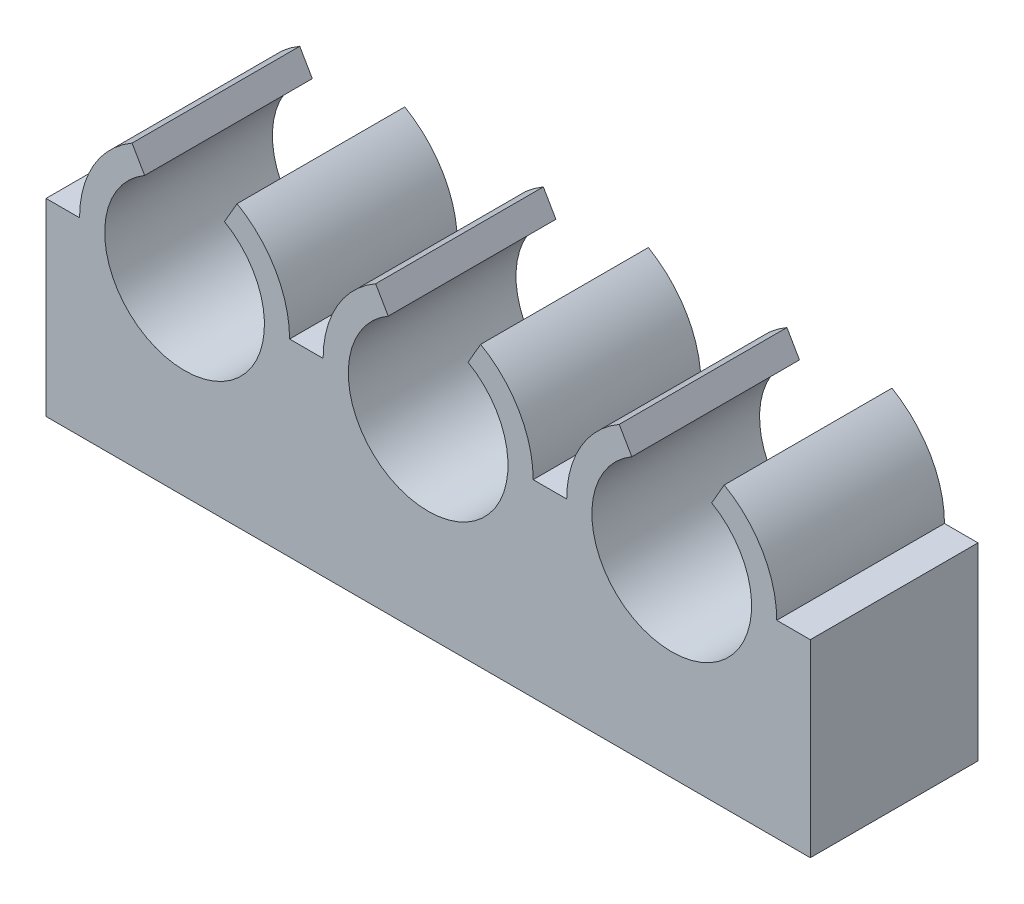
ISO-10303-21;
HEADER;
FILE_DESCRIPTION(('STEP AP214'),'2;1');
FILE_NAME('part.step','',(''),(''),'','','');
FILE_SCHEMA(('AUTOMOTIVE_DESIGN { 1 0 10303 214 1 1 1 1 }'));
ENDSEC;
DATA;
#1=APPLICATION_CONTEXT('core data for automotive mechanical design processes');
#2=APPLICATION_PROTOCOL_DEFINITION('international standard','automotive_design',2000,#1);
#3=PRODUCT_CONTEXT('',#1,'mechanical');
#4=PRODUCT('Part','Part','',(#3));
#5=PRODUCT_RELATED_PRODUCT_CATEGORY('part','',(#4));
#6=PRODUCT_DEFINITION_FORMATION('','',#4);
#7=PRODUCT_DEFINITION_CONTEXT('part definition',#1,'design');
#8=PRODUCT_DEFINITION('design','',#6,#7);
#9=PRODUCT_DEFINITION_SHAPE('','',#8);
#10=(LENGTH_UNIT() NAMED_UNIT(*) SI_UNIT(.MILLI.,.METRE.));
#11=(NAMED_UNIT(*) PLANE_ANGLE_UNIT() SI_UNIT($,.RADIAN.));
#12=(NAMED_UNIT(*) SI_UNIT($,.STERADIAN.) SOLID_ANGLE_UNIT());
#13=UNCERTAINTY_MEASURE_WITH_UNIT(LENGTH_MEASURE(1.E-05),#10,'distance_accuracy_value','');
#14=(GEOMETRIC_REPRESENTATION_CONTEXT(3) GLOBAL_UNCERTAINTY_ASSIGNED_CONTEXT((#13)) GLOBAL_UNIT_ASSIGNED_CONTEXT((#10,
#11,#12)) REPRESENTATION_CONTEXT('',''));
#15=CARTESIAN_POINT('',(0.,0.,0.));
#16=DIRECTION('',(0.,0.,1.));
#17=DIRECTION('',(1.,0.,0.));
#18=AXIS2_PLACEMENT_3D('',#15,#16,#17);
#19=CARTESIAN_POINT('',(0.,0.,10.));
#20=DIRECTION('',(0.,1.,0.));
#21=DIRECTION('',(-1.,0.,0.));
#22=AXIS2_PLACEMENT_3D('',#19,#20,#21);
#23=PLANE('',#22);
#24=DIRECTION('',(1.,0.,0.));
#25=VECTOR('',#24,1.);
#26=CARTESIAN_POINT('',(0.,0.,0.));
#27=LINE('',#26,#25);
#28=CARTESIAN_POINT('',(20.7875,0.,0.));
#29=VERTEX_POINT('',#28);
#30=CARTESIAN_POINT('',(22.7875,0.,0.));
#31=VERTEX_POINT('',#30);
#32=EDGE_CURVE('E213',#29,#31,#27,.T.);
#33=ORIENTED_EDGE('',*,*,#32,.F.);
#34=DIRECTION('',(0.,0.,-1.));
#35=VECTOR('',#34,1.);
#36=CARTESIAN_POINT('',(20.7875,0.,10.));
#37=LINE('',#36,#35);
#38=CARTESIAN_POINT('',(20.7875,0.,10.));
#39=VERTEX_POINT('',#38);
#40=EDGE_CURVE('E11',#39,#29,#37,.T.);
#41=ORIENTED_EDGE('',*,*,#40,.F.);
#42=DIRECTION('',(1.,0.,0.));
#43=VECTOR('',#42,1.);
#44=CARTESIAN_POINT('',(0.,0.,10.));
#45=LINE('',#44,#43);
#46=CARTESIAN_POINT('',(22.7875,0.,10.));
#47=VERTEX_POINT('',#46);
#48=EDGE_CURVE('E268',#39,#47,#45,.T.);
#49=ORIENTED_EDGE('',*,*,#48,.T.);
#50=DIRECTION('',(0.,0.,-1.));
#51=VECTOR('',#50,1.);
#52=CARTESIAN_POINT('',(22.7875,0.,10.));
#53=LINE('',#52,#51);
#54=EDGE_CURVE('E51',#47,#31,#53,.T.);
#55=ORIENTED_EDGE('',*,*,#54,.T.);
#56=EDGE_LOOP('',(#33,#41,#49,#55));
#57=FACE_BOUND('',#56,.T.);
#58=ADVANCED_FACE('F35',(#57),#23,.T.);
#59=CARTESIAN_POINT('',(14.525,0.,10.));
#60=DIRECTION('',(0.,0.,-1.));
#61=DIRECTION('',(-1.,0.,0.));
#62=AXIS2_PLACEMENT_3D('',#59,#60,#61);
#63=CYLINDRICAL_SURFACE('',#62,6.2625);
#64=CARTESIAN_POINT('',(14.525,0.,0.));
#65=DIRECTION('',(0.,0.,1.));
#66=DIRECTION('',(1.,0.,0.));
#67=AXIS2_PLACEMENT_3D('',#64,#65,#66);
#68=CIRCLE('',#67,6.2625);
#69=CARTESIAN_POINT('',(17.65625,5.42348409120007,0.));
#70=VERTEX_POINT('',#69);
#71=EDGE_CURVE('E215',#29,#70,#68,.T.);
#72=ORIENTED_EDGE('',*,*,#71,.T.);
#73=DIRECTION('',(0.,0.,-1.));
#74=VECTOR('',#73,1.);
#75=CARTESIAN_POINT('',(17.65625,5.42348409120007,10.));
#76=LINE('',#75,#74);
#77=CARTESIAN_POINT('',(17.65625,5.42348409120007,10.));
#78=VERTEX_POINT('',#77);
#79=EDGE_CURVE('E43',#78,#70,#76,.T.);
#80=ORIENTED_EDGE('',*,*,#79,.F.);
#81=CARTESIAN_POINT('',(14.525,0.,10.));
#82=DIRECTION('',(0.,0.,1.));
#83=DIRECTION('',(1.,0.,0.));
#84=AXIS2_PLACEMENT_3D('',#81,#82,#83);
#85=CIRCLE('',#84,6.2625);
#86=EDGE_CURVE('E326',#39,#78,#85,.T.);
#87=ORIENTED_EDGE('',*,*,#86,.F.);
#88=ORIENTED_EDGE('',*,*,#40,.T.);
#89=EDGE_LOOP('',(#72,#80,#87,#88));
#90=FACE_BOUND('',#89,.T.);
#91=ADVANCED_FACE('F313',(#90),#63,.T.);
#92=CARTESIAN_POINT('',(10.8937500000001,-6.28950949498444,10.));
#93=DIRECTION('',(-0.866025403784442,0.499999999999994,0.));
#94=DIRECTION('',(-0.499999999999994,-0.866025403784442,0.));
#95=AXIS2_PLACEMENT_3D('',#92,#93,#94);
#96=PLANE('',#95);
#97=DIRECTION('',(0.499999999999994,0.866025403784442,0.));
#98=VECTOR('',#97,1.);
#99=CARTESIAN_POINT('',(10.8937500000001,-6.28950949498444,0.));
#100=LINE('',#99,#98);
#101=CARTESIAN_POINT('',(16.90625,4.1244459855234,0.));
#102=VERTEX_POINT('',#101);
#103=EDGE_CURVE('E218',#102,#70,#100,.T.);
#104=ORIENTED_EDGE('',*,*,#103,.F.);
#105=DIRECTION('',(0.,0.,-1.));
#106=VECTOR('',#105,1.);
#107=CARTESIAN_POINT('',(16.90625,4.1244459855234,10.));
#108=LINE('',#107,#106);
#109=CARTESIAN_POINT('',(16.90625,4.1244459855234,10.));
#110=VERTEX_POINT('',#109);
#111=EDGE_CURVE('E303',#110,#102,#108,.T.);
#112=ORIENTED_EDGE('',*,*,#111,.F.);
#113=DIRECTION('',(0.499999999999994,0.866025403784442,0.));
#114=VECTOR('',#113,1.);
#115=CARTESIAN_POINT('',(10.8937500000001,-6.28950949498444,10.));
#116=LINE('',#115,#114);
#117=EDGE_CURVE('E310',#110,#78,#116,.T.);
#118=ORIENTED_EDGE('',*,*,#117,.T.);
#119=ORIENTED_EDGE('',*,*,#79,.T.);
#120=EDGE_LOOP('',(#104,#112,#118,#119));
#121=FACE_BOUND('',#120,.T.);
#122=ADVANCED_FACE('F308',(#121),#96,.T.);
#123=CARTESIAN_POINT('',(14.525,0.,10.));
#124=DIRECTION('',(0.,0.,-1.));
#125=DIRECTION('',(-1.,0.,0.));
#126=AXIS2_PLACEMENT_3D('',#123,#124,#125);
#127=CYLINDRICAL_SURFACE('',#126,4.7625);
#128=CARTESIAN_POINT('',(14.525,0.,0.));
#129=DIRECTION('',(0.,0.,1.));
#130=DIRECTION('',(1.,0.,0.));
#131=AXIS2_PLACEMENT_3D('',#128,#129,#130);
#132=CIRCLE('',#131,4.7625);
#133=CARTESIAN_POINT('',(12.14375,4.12444598552338,0.));
#134=VERTEX_POINT('',#133);
#135=EDGE_CURVE('E222',#134,#102,#132,.T.);
#136=ORIENTED_EDGE('',*,*,#135,.F.);
#137=DIRECTION('',(0.,0.,-1.));
#138=VECTOR('',#137,1.);
#139=CARTESIAN_POINT('',(12.14375,4.12444598552338,10.));
#140=LINE('',#139,#138);
#141=CARTESIAN_POINT('',(12.14375,4.12444598552338,10.));
#142=VERTEX_POINT('',#141);
#143=EDGE_CURVE('E301',#142,#134,#140,.T.);
#144=ORIENTED_EDGE('',*,*,#143,.F.);
#145=CARTESIAN_POINT('',(14.525,0.,10.));
#146=DIRECTION('',(0.,0.,1.));
#147=DIRECTION('',(1.,0.,0.));
#148=AXIS2_PLACEMENT_3D('',#145,#146,#147);
#149=CIRCLE('',#148,4.7625);
#150=EDGE_CURVE('E323',#142,#110,#149,.T.);
#151=ORIENTED_EDGE('',*,*,#150,.T.);
#152=ORIENTED_EDGE('',*,*,#111,.T.);
#153=EDGE_LOOP('',(#136,#144,#151,#152));
#154=FACE_BOUND('',#153,.T.);
#155=ADVANCED_FACE('F320',(#154),#127,.F.);
#156=CARTESIAN_POINT('',(10.89375,6.2895094949845,10.));
#157=DIRECTION('',(0.866025403784438,0.500000000000001,0.));
#158=DIRECTION('',(-0.500000000000001,0.866025403784438,0.));
#159=AXIS2_PLACEMENT_3D('',#156,#157,#158);
#160=PLANE('',#159);
#161=DIRECTION('',(0.500000000000001,-0.866025403784438,0.));
#162=VECTOR('',#161,1.);
#163=CARTESIAN_POINT('',(10.89375,6.2895094949845,0.));
#164=LINE('',#163,#162);
#165=CARTESIAN_POINT('',(11.39375,5.42348409120004,0.));
#166=VERTEX_POINT('',#165);
#167=EDGE_CURVE('E225',#166,#134,#164,.T.);
#168=ORIENTED_EDGE('',*,*,#167,.F.);
#169=DIRECTION('',(0.,0.,-1.));
#170=VECTOR('',#169,1.);
#171=CARTESIAN_POINT('',(11.39375,5.42348409120004,10.));
#172=LINE('',#171,#170);
#173=CARTESIAN_POINT('',(11.39375,5.42348409120004,10.));
#174=VERTEX_POINT('',#173);
#175=EDGE_CURVE('E299',#174,#166,#172,.T.);
#176=ORIENTED_EDGE('',*,*,#175,.F.);
#177=DIRECTION('',(0.500000000000001,-0.866025403784438,0.));
#178=VECTOR('',#177,1.);
#179=CARTESIAN_POINT('',(10.89375,6.2895094949845,10.));
#180=LINE('',#179,#178);
#181=EDGE_CURVE('E328',#174,#142,#180,.T.);
#182=ORIENTED_EDGE('',*,*,#181,.T.);
#183=ORIENTED_EDGE('',*,*,#143,.T.);
#184=EDGE_LOOP('',(#168,#176,#182,#183));
#185=FACE_BOUND('',#184,.T.);
#186=ADVANCED_FACE('F397',(#185),#160,.T.);
#187=CARTESIAN_POINT('',(8.2625,0.,0.));
#188=VERTEX_POINT('',#187);
#189=EDGE_CURVE('E219',#166,#188,#68,.T.);
#190=ORIENTED_EDGE('',*,*,#189,.T.);
#191=DIRECTION('',(0.,0.,-1.));
#192=VECTOR('',#191,1.);
#193=CARTESIAN_POINT('',(8.2625,0.,10.));
#194=LINE('',#193,#192);
#195=CARTESIAN_POINT('',(8.2625,0.,10.));
#196=VERTEX_POINT('',#195);
#197=EDGE_CURVE('E297',#196,#188,#194,.T.);
#198=ORIENTED_EDGE('',*,*,#197,.F.);
#199=EDGE_CURVE('E331',#174,#196,#85,.T.);
#200=ORIENTED_EDGE('',*,*,#199,.F.);
#201=ORIENTED_EDGE('',*,*,#175,.T.);
#202=EDGE_LOOP('',(#190,#198,#200,#201));
#203=FACE_BOUND('',#202,.T.);
#204=ADVANCED_FACE('F389',(#203),#63,.T.);
#205=CARTESIAN_POINT('',(0.,0.,10.));
#206=DIRECTION('',(0.,1.,0.));
#207=DIRECTION('',(0.,0.,1.));
#208=AXIS2_PLACEMENT_3D('',#205,#206,#207);
#209=PLANE('',#208);
#210=DIRECTION('',(1.,0.,0.));
#211=VECTOR('',#210,1.);
#212=CARTESIAN_POINT('',(0.,0.,0.));
#213=LINE('',#212,#211);
#214=CARTESIAN_POINT('',(6.2625,0.,0.));
#215=VERTEX_POINT('',#214);
#216=EDGE_CURVE('E228',#215,#188,#213,.T.);
#217=ORIENTED_EDGE('',*,*,#216,.F.);
#218=DIRECTION('',(0.,0.,-1.));
#219=VECTOR('',#218,1.);
#220=CARTESIAN_POINT('',(6.2625,0.,10.));
#221=LINE('',#220,#219);
#222=CARTESIAN_POINT('',(6.2625,0.,10.));
#223=VERTEX_POINT('',#222);
#224=EDGE_CURVE('E295',#223,#215,#221,.T.);
#225=ORIENTED_EDGE('',*,*,#224,.F.);
#226=DIRECTION('',(1.,0.,0.));
#227=VECTOR('',#226,1.);
#228=CARTESIAN_POINT('',(0.,0.,10.));
#229=LINE('',#228,#227);
#230=EDGE_CURVE('E335',#223,#196,#229,.T.);
#231=ORIENTED_EDGE('',*,*,#230,.T.);
#232=ORIENTED_EDGE('',*,*,#197,.T.);
#233=EDGE_LOOP('',(#217,#225,#231,#232));
#234=FACE_BOUND('',#233,.T.);
#235=ADVANCED_FACE('F396',(#234),#209,.T.);
#236=CARTESIAN_POINT('',(0.,0.,10.));
#237=DIRECTION('',(0.,0.,-1.));
#238=DIRECTION('',(-1.,0.,0.));
#239=AXIS2_PLACEMENT_3D('',#236,#237,#238);
#240=CYLINDRICAL_SURFACE('',#239,6.2625);
#241=CARTESIAN_POINT('',(0.,0.,0.));
#242=DIRECTION('',(0.,0.,1.));
#243=DIRECTION('',(1.,0.,0.));
#244=AXIS2_PLACEMENT_3D('',#241,#242,#243);
#245=CIRCLE('',#244,6.2625);
#246=CARTESIAN_POINT('',(3.13124999999997,5.42348409120006,0.));
#247=VERTEX_POINT('',#246);
#248=EDGE_CURVE('E231',#215,#247,#245,.T.);
#249=ORIENTED_EDGE('',*,*,#248,.T.);
#250=DIRECTION('',(0.,0.,-1.));
#251=VECTOR('',#250,1.);
#252=CARTESIAN_POINT('',(3.13124999999997,5.42348409120006,10.));
#253=LINE('',#252,#251);
#254=CARTESIAN_POINT('',(3.13124999999997,5.42348409120006,10.));
#255=VERTEX_POINT('',#254);
#256=EDGE_CURVE('E293',#255,#247,#253,.T.);
#257=ORIENTED_EDGE('',*,*,#256,.F.);
#258=CARTESIAN_POINT('',(0.,0.,10.));
#259=DIRECTION('',(0.,0.,1.));
#260=DIRECTION('',(1.,0.,0.));
#261=AXIS2_PLACEMENT_3D('',#258,#259,#260);
#262=CIRCLE('',#261,6.2625);
#263=EDGE_CURVE('E338',#223,#255,#262,.T.);
#264=ORIENTED_EDGE('',*,*,#263,.F.);
#265=ORIENTED_EDGE('',*,*,#224,.T.);
#266=EDGE_LOOP('',(#249,#257,#264,#265));
#267=FACE_BOUND('',#266,.T.);
#268=ADVANCED_FACE('F403',(#267),#240,.T.);
#269=CARTESIAN_POINT('',(0.,0.,10.));
#270=DIRECTION('',(-0.866025403784442,0.499999999999995,0.));
#271=DIRECTION('',(-0.499999999999995,-0.866025403784442,0.));
#272=AXIS2_PLACEMENT_3D('',#269,#270,#271);
#273=PLANE('',#272);
#274=DIRECTION('',(0.499999999999995,0.866025403784442,0.));
#275=VECTOR('',#274,1.);
#276=CARTESIAN_POINT('',(0.,0.,0.));
#277=LINE('',#276,#275);
#278=CARTESIAN_POINT('',(2.38124999999997,4.1244459855234,0.));
#279=VERTEX_POINT('',#278);
#280=EDGE_CURVE('E234',#279,#247,#277,.T.);
#281=ORIENTED_EDGE('',*,*,#280,.F.);
#282=DIRECTION('',(0.,0.,-1.));
#283=VECTOR('',#282,1.);
#284=CARTESIAN_POINT('',(2.38124999999997,4.1244459855234,10.));
#285=LINE('',#284,#283);
#286=CARTESIAN_POINT('',(2.38124999999997,4.1244459855234,10.));
#287=VERTEX_POINT('',#286);
#288=EDGE_CURVE('E291',#287,#279,#285,.T.);
#289=ORIENTED_EDGE('',*,*,#288,.F.);
#290=DIRECTION('',(0.499999999999995,0.866025403784442,0.));
#291=VECTOR('',#290,1.);
#292=CARTESIAN_POINT('',(0.,0.,10.));
#293=LINE('',#292,#291);
#294=EDGE_CURVE('E340',#287,#255,#293,.T.);
#295=ORIENTED_EDGE('',*,*,#294,.T.);
#296=ORIENTED_EDGE('',*,*,#256,.T.);
#297=EDGE_LOOP('',(#281,#289,#295,#296));
#298=FACE_BOUND('',#297,.T.);
#299=ADVANCED_FACE('F419',(#298),#273,.T.);
#300=CARTESIAN_POINT('',(0.,0.,10.));
#301=DIRECTION('',(0.,0.,-1.));
#302=DIRECTION('',(-1.,0.,0.));
#303=AXIS2_PLACEMENT_3D('',#300,#301,#302);
#304=CYLINDRICAL_SURFACE('',#303,4.7625);
#305=CARTESIAN_POINT('',(0.,0.,0.));
#306=DIRECTION('',(0.,0.,1.));
#307=DIRECTION('',(1.,0.,0.));
#308=AXIS2_PLACEMENT_3D('',#305,#306,#307);
#309=CIRCLE('',#308,4.7625);
#310=CARTESIAN_POINT('',(-2.38125000000001,4.12444598552339,0.));
#311=VERTEX_POINT('',#310);
#312=EDGE_CURVE('E238',#311,#279,#309,.T.);
#313=ORIENTED_EDGE('',*,*,#312,.F.);
#314=DIRECTION('',(0.,0.,-1.));
#315=VECTOR('',#314,1.);
#316=CARTESIAN_POINT('',(-2.38125000000001,4.12444598552339,10.));
#317=LINE('',#316,#315);
#318=CARTESIAN_POINT('',(-2.38125000000001,4.12444598552339,10.));
#319=VERTEX_POINT('',#318);
#320=EDGE_CURVE('E289',#319,#311,#317,.T.);
#321=ORIENTED_EDGE('',*,*,#320,.F.);
#322=CARTESIAN_POINT('',(0.,0.,10.));
#323=DIRECTION('',(0.,0.,1.));
#324=DIRECTION('',(1.,0.,0.));
#325=AXIS2_PLACEMENT_3D('',#322,#323,#324);
#326=CIRCLE('',#325,4.7625);
#327=EDGE_CURVE('E344',#319,#287,#326,.T.);
#328=ORIENTED_EDGE('',*,*,#327,.T.);
#329=ORIENTED_EDGE('',*,*,#288,.T.);
#330=EDGE_LOOP('',(#313,#321,#328,#329));
#331=FACE_BOUND('',#330,.T.);
#332=ADVANCED_FACE('F422',(#331),#304,.F.);
#333=CARTESIAN_POINT('',(0.,0.,10.));
#334=DIRECTION('',(0.866025403784438,0.500000000000001,0.));
#335=DIRECTION('',(-0.500000000000001,0.866025403784438,0.));
#336=AXIS2_PLACEMENT_3D('',#333,#334,#335);
#337=PLANE('',#336);
#338=DIRECTION('',(0.500000000000001,-0.866025403784438,0.));
#339=VECTOR('',#338,1.);
#340=CARTESIAN_POINT('',(0.,0.,0.));
#341=LINE('',#340,#339);
#342=CARTESIAN_POINT('',(-3.13125000000001,5.42348409120004,0.));
#343=VERTEX_POINT('',#342);
#344=EDGE_CURVE('E241',#343,#311,#341,.T.);
#345=ORIENTED_EDGE('',*,*,#344,.F.);
#346=DIRECTION('',(0.,0.,-1.));
#347=VECTOR('',#346,1.);
#348=CARTESIAN_POINT('',(-3.13125000000001,5.42348409120004,10.));
#349=LINE('',#348,#347);
#350=CARTESIAN_POINT('',(-3.13125000000001,5.42348409120004,10.));
#351=VERTEX_POINT('',#350);
#352=EDGE_CURVE('E287',#351,#343,#349,.T.);
#353=ORIENTED_EDGE('',*,*,#352,.F.);
#354=DIRECTION('',(0.500000000000001,-0.866025403784438,0.));
#355=VECTOR('',#354,1.);
#356=CARTESIAN_POINT('',(0.,0.,10.));
#357=LINE('',#356,#355);
#358=EDGE_CURVE('E347',#351,#319,#357,.T.);
#359=ORIENTED_EDGE('',*,*,#358,.T.);
#360=ORIENTED_EDGE('',*,*,#320,.T.);
#361=EDGE_LOOP('',(#345,#353,#359,#360));
#362=FACE_BOUND('',#361,.T.);
#363=ADVANCED_FACE('F426',(#362),#337,.T.);
#364=CARTESIAN_POINT('',(-6.2625,0.,0.));
#365=VERTEX_POINT('',#364);
#366=EDGE_CURVE('E235',#343,#365,#245,.T.);
#367=ORIENTED_EDGE('',*,*,#366,.T.);
#368=DIRECTION('',(0.,0.,-1.));
#369=VECTOR('',#368,1.);
#370=CARTESIAN_POINT('',(-6.2625,0.,10.));
#371=LINE('',#370,#369);
#372=CARTESIAN_POINT('',(-6.2625,0.,10.));
#373=VERTEX_POINT('',#372);
#374=EDGE_CURVE('E285',#373,#365,#371,.T.);
#375=ORIENTED_EDGE('',*,*,#374,.F.);
#376=EDGE_CURVE('E341',#351,#373,#262,.T.);
#377=ORIENTED_EDGE('',*,*,#376,.F.);
#378=ORIENTED_EDGE('',*,*,#352,.T.);
#379=EDGE_LOOP('',(#367,#375,#377,#378));
#380=FACE_BOUND('',#379,.T.);
#381=ADVANCED_FACE('F432',(#380),#240,.T.);
#382=CARTESIAN_POINT('',(0.,0.,10.));
#383=DIRECTION('',(0.,1.,0.));
#384=DIRECTION('',(0.,0.,1.));
#385=AXIS2_PLACEMENT_3D('',#382,#383,#384);
#386=PLANE('',#385);
#387=DIRECTION('',(1.,0.,0.));
#388=VECTOR('',#387,1.);
#389=CARTESIAN_POINT('',(0.,0.,0.));
#390=LINE('',#389,#388);
#391=CARTESIAN_POINT('',(-8.2625,0.,0.));
#392=VERTEX_POINT('',#391);
#393=EDGE_CURVE('E244',#392,#365,#390,.T.);
#394=ORIENTED_EDGE('',*,*,#393,.F.);
#395=DIRECTION('',(0.,0.,-1.));
#396=VECTOR('',#395,1.);
#397=CARTESIAN_POINT('',(-8.2625,0.,10.));
#398=LINE('',#397,#396);
#399=CARTESIAN_POINT('',(-8.2625,0.,10.));
#400=VERTEX_POINT('',#399);
#401=EDGE_CURVE('E283',#400,#392,#398,.T.);
#402=ORIENTED_EDGE('',*,*,#401,.F.);
#403=DIRECTION('',(1.,0.,0.));
#404=VECTOR('',#403,1.);
#405=CARTESIAN_POINT('',(0.,0.,10.));
#406=LINE('',#405,#404);
#407=EDGE_CURVE('E350',#400,#373,#406,.T.);
#408=ORIENTED_EDGE('',*,*,#407,.T.);
#409=ORIENTED_EDGE('',*,*,#374,.T.);
#410=EDGE_LOOP('',(#394,#402,#408,#409));
#411=FACE_BOUND('',#410,.T.);
#412=ADVANCED_FACE('F439',(#411),#386,.T.);
#413=CARTESIAN_POINT('',(-14.525,0.,10.));
#414=DIRECTION('',(0.,0.,-1.));
#415=DIRECTION('',(-1.,0.,0.));
#416=AXIS2_PLACEMENT_3D('',#413,#414,#415);
#417=CYLINDRICAL_SURFACE('',#416,6.2625);
#418=CARTESIAN_POINT('',(-14.525,0.,0.));
#419=DIRECTION('',(0.,0.,1.));
#420=DIRECTION('',(1.,0.,0.));
#421=AXIS2_PLACEMENT_3D('',#418,#419,#420);
#422=CIRCLE('',#421,6.2625);
#423=CARTESIAN_POINT('',(-11.39375,5.42348409120007,0.));
#424=VERTEX_POINT('',#423);
#425=EDGE_CURVE('E247',#392,#424,#422,.T.);
#426=ORIENTED_EDGE('',*,*,#425,.T.);
#427=DIRECTION('',(0.,0.,-1.));
#428=VECTOR('',#427,1.);
#429=CARTESIAN_POINT('',(-11.39375,5.42348409120007,10.));
#430=LINE('',#429,#428);
#431=CARTESIAN_POINT('',(-11.39375,5.42348409120007,10.));
#432=VERTEX_POINT('',#431);
#433=EDGE_CURVE('E281',#432,#424,#430,.T.);
#434=ORIENTED_EDGE('',*,*,#433,.F.);
#435=CARTESIAN_POINT('',(-14.525,0.,10.));
#436=DIRECTION('',(0.,0.,1.));
#437=DIRECTION('',(1.,0.,0.));
#438=AXIS2_PLACEMENT_3D('',#435,#436,#437);
#439=CIRCLE('',#438,6.2625);
#440=EDGE_CURVE('E353',#400,#432,#439,.T.);
#441=ORIENTED_EDGE('',*,*,#440,.F.);
#442=ORIENTED_EDGE('',*,*,#401,.T.);
#443=EDGE_LOOP('',(#426,#434,#441,#442));
#444=FACE_BOUND('',#443,.T.);
#445=ADVANCED_FACE('F442',(#444),#417,.T.);
#446=CARTESIAN_POINT('',(-10.8937500000001,6.28950949498444,10.));
#447=DIRECTION('',(-0.866025403784442,0.499999999999994,0.));
#448=DIRECTION('',(-0.499999999999994,-0.866025403784442,0.));
#449=AXIS2_PLACEMENT_3D('',#446,#447,#448);
#450=PLANE('',#449);
#451=DIRECTION('',(0.499999999999994,0.866025403784442,0.));
#452=VECTOR('',#451,1.);
#453=CARTESIAN_POINT('',(-10.8937500000001,6.28950949498444,0.));
#454=LINE('',#453,#452);
#455=CARTESIAN_POINT('',(-12.14375,4.12444598552341,0.));
#456=VERTEX_POINT('',#455);
#457=EDGE_CURVE('E250',#456,#424,#454,.T.);
#458=ORIENTED_EDGE('',*,*,#457,.F.);
#459=DIRECTION('',(0.,0.,-1.));
#460=VECTOR('',#459,1.);
#461=CARTESIAN_POINT('',(-12.14375,4.12444598552341,10.));
#462=LINE('',#461,#460);
#463=CARTESIAN_POINT('',(-12.14375,4.12444598552341,10.));
#464=VERTEX_POINT('',#463);
#465=EDGE_CURVE('E279',#464,#456,#462,.T.);
#466=ORIENTED_EDGE('',*,*,#465,.F.);
#467=DIRECTION('',(0.499999999999994,0.866025403784442,0.));
#468=VECTOR('',#467,1.);
#469=CARTESIAN_POINT('',(-10.8937500000001,6.28950949498444,10.));
#470=LINE('',#469,#468);
#471=EDGE_CURVE('E355',#464,#432,#470,.T.);
#472=ORIENTED_EDGE('',*,*,#471,.T.);
#473=ORIENTED_EDGE('',*,*,#433,.T.);
#474=EDGE_LOOP('',(#458,#466,#472,#473));
#475=FACE_BOUND('',#474,.T.);
#476=ADVANCED_FACE('F445',(#475),#450,.T.);
#477=CARTESIAN_POINT('',(-14.525,0.,10.));
#478=DIRECTION('',(0.,0.,-1.));
#479=DIRECTION('',(-1.,0.,0.));
#480=AXIS2_PLACEMENT_3D('',#477,#478,#479);
#481=CYLINDRICAL_SURFACE('',#480,4.7625);
#482=CARTESIAN_POINT('',(-14.525,0.,0.));
#483=DIRECTION('',(0.,0.,1.));
#484=DIRECTION('',(1.,0.,0.));
#485=AXIS2_PLACEMENT_3D('',#482,#483,#484);
#486=CIRCLE('',#485,4.7625);
#487=CARTESIAN_POINT('',(-16.90625,4.12444598552339,0.));
#488=VERTEX_POINT('',#487);
#489=EDGE_CURVE('E254',#488,#456,#486,.T.);
#490=ORIENTED_EDGE('',*,*,#489,.F.);
#491=DIRECTION('',(0.,0.,-1.));
#492=VECTOR('',#491,1.);
#493=CARTESIAN_POINT('',(-16.90625,4.12444598552339,10.));
#494=LINE('',#493,#492);
#495=CARTESIAN_POINT('',(-16.90625,4.12444598552339,10.));
#496=VERTEX_POINT('',#495);
#497=EDGE_CURVE('E277',#496,#488,#494,.T.);
#498=ORIENTED_EDGE('',*,*,#497,.F.);
#499=CARTESIAN_POINT('',(-14.525,0.,10.));
#500=DIRECTION('',(0.,0.,1.));
#501=DIRECTION('',(1.,0.,0.));
#502=AXIS2_PLACEMENT_3D('',#499,#500,#501);
#503=CIRCLE('',#502,4.7625);
#504=EDGE_CURVE('E359',#496,#464,#503,.T.);
#505=ORIENTED_EDGE('',*,*,#504,.T.);
#506=ORIENTED_EDGE('',*,*,#465,.T.);
#507=EDGE_LOOP('',(#490,#498,#505,#506));
#508=FACE_BOUND('',#507,.T.);
#509=ADVANCED_FACE('F448',(#508),#481,.F.);
#510=CARTESIAN_POINT('',(-10.89375,-6.2895094949845,10.));
#511=DIRECTION('',(0.866025403784438,0.500000000000002,0.));
#512=DIRECTION('',(-0.500000000000002,0.866025403784438,0.));
#513=AXIS2_PLACEMENT_3D('',#510,#511,#512);
#514=PLANE('',#513);
#515=DIRECTION('',(0.500000000000002,-0.866025403784438,0.));
#516=VECTOR('',#515,1.);
#517=CARTESIAN_POINT('',(-10.89375,-6.2895094949845,0.));
#518=LINE('',#517,#516);
#519=CARTESIAN_POINT('',(-17.65625,5.42348409120004,0.));
#520=VERTEX_POINT('',#519);
#521=EDGE_CURVE('E257',#520,#488,#518,.T.);
#522=ORIENTED_EDGE('',*,*,#521,.F.);
#523=DIRECTION('',(0.,0.,-1.));
#524=VECTOR('',#523,1.);
#525=CARTESIAN_POINT('',(-17.65625,5.42348409120004,10.));
#526=LINE('',#525,#524);
#527=CARTESIAN_POINT('',(-17.65625,5.42348409120004,10.));
#528=VERTEX_POINT('',#527);
#529=EDGE_CURVE('E275',#528,#520,#526,.T.);
#530=ORIENTED_EDGE('',*,*,#529,.F.);
#531=DIRECTION('',(0.500000000000002,-0.866025403784438,0.));
#532=VECTOR('',#531,1.);
#533=CARTESIAN_POINT('',(-10.89375,-6.2895094949845,10.));
#534=LINE('',#533,#532);
#535=EDGE_CURVE('E362',#528,#496,#534,.T.);
#536=ORIENTED_EDGE('',*,*,#535,.T.);
#537=ORIENTED_EDGE('',*,*,#497,.T.);
#538=EDGE_LOOP('',(#522,#530,#536,#537));
#539=FACE_BOUND('',#538,.T.);
#540=ADVANCED_FACE('F451',(#539),#514,.T.);
#541=CARTESIAN_POINT('',(-20.7875,0.,0.));
#542=VERTEX_POINT('',#541);
#543=EDGE_CURVE('E251',#520,#542,#422,.T.);
#544=ORIENTED_EDGE('',*,*,#543,.T.);
#545=DIRECTION('',(0.,0.,-1.));
#546=VECTOR('',#545,1.);
#547=CARTESIAN_POINT('',(-20.7875,0.,10.));
#548=LINE('',#547,#546);
#549=CARTESIAN_POINT('',(-20.7875,0.,10.));
#550=VERTEX_POINT('',#549);
#551=EDGE_CURVE('E272',#550,#542,#548,.T.);
#552=ORIENTED_EDGE('',*,*,#551,.F.);
#553=EDGE_CURVE('E356',#528,#550,#439,.T.);
#554=ORIENTED_EDGE('',*,*,#553,.F.);
#555=ORIENTED_EDGE('',*,*,#529,.T.);
#556=EDGE_LOOP('',(#544,#552,#554,#555));
#557=FACE_BOUND('',#556,.T.);
#558=ADVANCED_FACE('F369',(#557),#417,.T.);
#559=CARTESIAN_POINT('',(0.,0.,10.));
#560=DIRECTION('',(0.,-1.,0.));
#561=DIRECTION('',(1.,0.,0.));
#562=AXIS2_PLACEMENT_3D('',#559,#560,#561);
#563=PLANE('',#562);
#564=DIRECTION('',(-1.,0.,0.));
#565=VECTOR('',#564,1.);
#566=CARTESIAN_POINT('',(0.,0.,0.));
#567=LINE('',#566,#565);
#568=CARTESIAN_POINT('',(-22.7875,0.,0.));
#569=VERTEX_POINT('',#568);
#570=EDGE_CURVE('E260',#542,#569,#567,.T.);
#571=ORIENTED_EDGE('',*,*,#570,.T.);
#572=DIRECTION('',(0.,0.,-1.));
#573=VECTOR('',#572,1.);
#574=CARTESIAN_POINT('',(-22.7875,0.,10.));
#575=LINE('',#574,#573);
#576=CARTESIAN_POINT('',(-22.7875,0.,10.));
#577=VERTEX_POINT('',#576);
#578=EDGE_CURVE('E205',#577,#569,#575,.T.);
#579=ORIENTED_EDGE('',*,*,#578,.F.);
#580=DIRECTION('',(-1.,0.,0.));
#581=VECTOR('',#580,1.);
#582=CARTESIAN_POINT('',(0.,0.,10.));
#583=LINE('',#582,#581);
#584=EDGE_CURVE('E193',#550,#577,#583,.T.);
#585=ORIENTED_EDGE('',*,*,#584,.F.);
#586=ORIENTED_EDGE('',*,*,#551,.T.);
#587=EDGE_LOOP('',(#571,#579,#585,#586));
#588=FACE_BOUND('',#587,.T.);
#589=ADVANCED_FACE('F373',(#588),#563,.F.);
#590=CARTESIAN_POINT('',(-22.7875,0.,10.));
#591=DIRECTION('',(1.,0.,0.));
#592=DIRECTION('',(0.,0.,-1.));
#593=AXIS2_PLACEMENT_3D('',#590,#591,#592);
#594=PLANE('',#593);
#595=DIRECTION('',(0.,-1.,0.));
#596=VECTOR('',#595,1.);
#597=CARTESIAN_POINT('',(-22.7875,0.,0.));
#598=LINE('',#597,#596);
#599=CARTESIAN_POINT('',(-22.7875,-11.2625,0.));
#600=VERTEX_POINT('',#599);
#601=EDGE_CURVE('E202',#569,#600,#598,.T.);
#602=ORIENTED_EDGE('',*,*,#601,.T.);
#603=DIRECTION('',(0.,0.,-1.));
#604=VECTOR('',#603,1.);
#605=CARTESIAN_POINT('',(-22.7875,-11.2625,10.));
#606=LINE('',#605,#604);
#607=CARTESIAN_POINT('',(-22.7875,-11.2625,10.));
#608=VERTEX_POINT('',#607);
#609=EDGE_CURVE('E199',#608,#600,#606,.T.);
#610=ORIENTED_EDGE('',*,*,#609,.F.);
#611=DIRECTION('',(0.,-1.,0.));
#612=VECTOR('',#611,1.);
#613=CARTESIAN_POINT('',(-22.7875,0.,10.));
#614=LINE('',#613,#612);
#615=EDGE_CURVE('E185',#577,#608,#614,.T.);
#616=ORIENTED_EDGE('',*,*,#615,.F.);
#617=ORIENTED_EDGE('',*,*,#578,.T.);
#618=EDGE_LOOP('',(#602,#610,#616,#617));
#619=FACE_BOUND('',#618,.T.);
#620=ADVANCED_FACE('F200',(#619),#594,.F.);
#621=CARTESIAN_POINT('',(0.,-11.2625,10.));
#622=DIRECTION('',(0.,1.,0.));
#623=DIRECTION('',(0.,0.,1.));
#624=AXIS2_PLACEMENT_3D('',#621,#622,#623);
#625=PLANE('',#624);
#626=DIRECTION('',(1.,0.,0.));
#627=VECTOR('',#626,1.);
#628=CARTESIAN_POINT('',(0.,-11.2625,0.));
#629=LINE('',#628,#627);
#630=CARTESIAN_POINT('',(22.7875,-11.2625,0.));
#631=VERTEX_POINT('',#630);
#632=EDGE_CURVE('E263',#600,#631,#629,.T.);
#633=ORIENTED_EDGE('',*,*,#632,.T.);
#634=DIRECTION('',(0.,0.,-1.));
#635=VECTOR('',#634,1.);
#636=CARTESIAN_POINT('',(22.7875,-11.2625,10.));
#637=LINE('',#636,#635);
#638=CARTESIAN_POINT('',(22.7875,-11.2625,10.));
#639=VERTEX_POINT('',#638);
#640=EDGE_CURVE('E119',#639,#631,#637,.T.);
#641=ORIENTED_EDGE('',*,*,#640,.F.);
#642=DIRECTION('',(1.,0.,0.));
#643=VECTOR('',#642,1.);
#644=CARTESIAN_POINT('',(0.,-11.2625,10.));
#645=LINE('',#644,#643);
#646=EDGE_CURVE('E191',#608,#639,#645,.T.);
#647=ORIENTED_EDGE('',*,*,#646,.F.);
#648=ORIENTED_EDGE('',*,*,#609,.T.);
#649=EDGE_LOOP('',(#633,#641,#647,#648));
#650=FACE_BOUND('',#649,.T.);
#651=ADVANCED_FACE('F207',(#650),#625,.F.);
#652=CARTESIAN_POINT('',(22.7875,0.,10.));
#653=DIRECTION('',(1.,0.,0.));
#654=DIRECTION('',(0.,0.,-1.));
#655=AXIS2_PLACEMENT_3D('',#652,#653,#654);
#656=PLANE('',#655);
#657=DIRECTION('',(0.,-1.,0.));
#658=VECTOR('',#657,1.);
#659=CARTESIAN_POINT('',(22.7875,0.,0.));
#660=LINE('',#659,#658);
#661=EDGE_CURVE('E265',#31,#631,#660,.T.);
#662=ORIENTED_EDGE('',*,*,#661,.F.);
#663=ORIENTED_EDGE('',*,*,#54,.F.);
#664=DIRECTION('',(0.,-1.,0.));
#665=VECTOR('',#664,1.);
#666=CARTESIAN_POINT('',(22.7875,0.,10.));
#667=LINE('',#666,#665);
#668=EDGE_CURVE('E208',#47,#639,#667,.T.);
#669=ORIENTED_EDGE('',*,*,#668,.T.);
#670=ORIENTED_EDGE('',*,*,#640,.T.);
#671=EDGE_LOOP('',(#662,#663,#669,#670));
#672=FACE_BOUND('',#671,.T.);
#673=ADVANCED_FACE('F374',(#672),#656,.T.);
#674=CARTESIAN_POINT('',(0.,0.,10.));
#675=DIRECTION('',(0.,0.,1.));
#676=DIRECTION('',(1.,0.,0.));
#677=AXIS2_PLACEMENT_3D('',#674,#675,#676);
#678=PLANE('',#677);
#679=ORIENTED_EDGE('',*,*,#48,.F.);
#680=ORIENTED_EDGE('',*,*,#86,.T.);
#681=ORIENTED_EDGE('',*,*,#117,.F.);
#682=ORIENTED_EDGE('',*,*,#150,.F.);
#683=ORIENTED_EDGE('',*,*,#181,.F.);
#684=ORIENTED_EDGE('',*,*,#199,.T.);
#685=ORIENTED_EDGE('',*,*,#230,.F.);
#686=ORIENTED_EDGE('',*,*,#263,.T.);
#687=ORIENTED_EDGE('',*,*,#294,.F.);
#688=ORIENTED_EDGE('',*,*,#327,.F.);
#689=ORIENTED_EDGE('',*,*,#358,.F.);
#690=ORIENTED_EDGE('',*,*,#376,.T.);
#691=ORIENTED_EDGE('',*,*,#407,.F.);
#692=ORIENTED_EDGE('',*,*,#440,.T.);
#693=ORIENTED_EDGE('',*,*,#471,.F.);
#694=ORIENTED_EDGE('',*,*,#504,.F.);
#695=ORIENTED_EDGE('',*,*,#535,.F.);
#696=ORIENTED_EDGE('',*,*,#553,.T.);
#697=ORIENTED_EDGE('',*,*,#584,.T.);
#698=ORIENTED_EDGE('',*,*,#615,.T.);
#699=ORIENTED_EDGE('',*,*,#646,.T.);
#700=ORIENTED_EDGE('',*,*,#668,.F.);
#701=EDGE_LOOP('',(#679,#680,#681,#682,#683,#684,#685,#686,#687,#688,#689,#690,#691,#692,#693,
#694,#695,#696,#697,#698,#699,#700));
#702=FACE_BOUND('',#701,.T.);
#703=ADVANCED_FACE('F188',(#702),#678,.T.);
#704=CARTESIAN_POINT('',(0.,0.,0.));
#705=DIRECTION('',(0.,0.,1.));
#706=DIRECTION('',(1.,0.,0.));
#707=AXIS2_PLACEMENT_3D('',#704,#705,#706);
#708=PLANE('',#707);
#709=ORIENTED_EDGE('',*,*,#32,.T.);
#710=ORIENTED_EDGE('',*,*,#661,.T.);
#711=ORIENTED_EDGE('',*,*,#632,.F.);
#712=ORIENTED_EDGE('',*,*,#601,.F.);
#713=ORIENTED_EDGE('',*,*,#570,.F.);
#714=ORIENTED_EDGE('',*,*,#543,.F.);
#715=ORIENTED_EDGE('',*,*,#521,.T.);
#716=ORIENTED_EDGE('',*,*,#489,.T.);
#717=ORIENTED_EDGE('',*,*,#457,.T.);
#718=ORIENTED_EDGE('',*,*,#425,.F.);
#719=ORIENTED_EDGE('',*,*,#393,.T.);
#720=ORIENTED_EDGE('',*,*,#366,.F.);
#721=ORIENTED_EDGE('',*,*,#344,.T.);
#722=ORIENTED_EDGE('',*,*,#312,.T.);
#723=ORIENTED_EDGE('',*,*,#280,.T.);
#724=ORIENTED_EDGE('',*,*,#248,.F.);
#725=ORIENTED_EDGE('',*,*,#216,.T.);
#726=ORIENTED_EDGE('',*,*,#189,.F.);
#727=ORIENTED_EDGE('',*,*,#167,.T.);
#728=ORIENTED_EDGE('',*,*,#135,.T.);
#729=ORIENTED_EDGE('',*,*,#103,.T.);
#730=ORIENTED_EDGE('',*,*,#71,.F.);
#731=EDGE_LOOP('',(#709,#710,#711,#712,#713,#714,#715,#716,#717,#718,#719,#720,#721,#722,#723,
#724,#725,#726,#727,#728,#729,#730));
#732=FACE_BOUND('',#731,.T.);
#733=ADVANCED_FACE('F315',(#732),#708,.F.);
#734=CLOSED_SHELL('',(#58,#91,#122,#155,#186,#204,#235,#268,#299,#332,#363,#381,#412,#445,#476,
#509,#540,#558,#589,#620,#651,#673,#703,#733));
#735=MANIFOLD_SOLID_BREP('B2',#734);
#736=ADVANCED_BREP_SHAPE_REPRESENTATION('',(#18,#735),#14);
#737=SHAPE_DEFINITION_REPRESENTATION(#9,#736);
ENDSEC;
END-ISO-10303-21;
